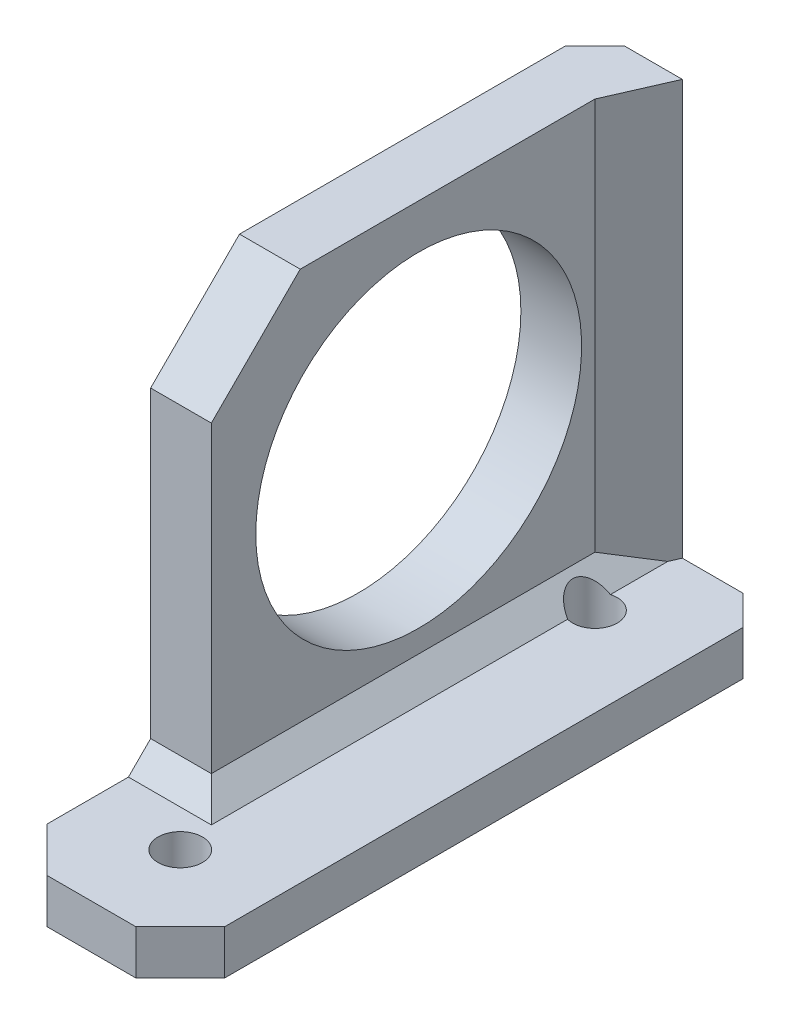
ISO-10303-21;
HEADER;
FILE_DESCRIPTION(('STEP AP214'),'2;1');
FILE_NAME('part.step','',(''),(''),'','','');
FILE_SCHEMA(('AUTOMOTIVE_DESIGN { 1 0 10303 214 1 1 1 1 }'));
ENDSEC;
DATA;
#1=APPLICATION_CONTEXT('core data for automotive mechanical design processes');
#2=APPLICATION_PROTOCOL_DEFINITION('international standard','automotive_design',2000,#1);
#3=PRODUCT_CONTEXT('',#1,'mechanical');
#4=PRODUCT('Part','Part','',(#3));
#5=PRODUCT_RELATED_PRODUCT_CATEGORY('part','',(#4));
#6=PRODUCT_DEFINITION_FORMATION('','',#4);
#7=PRODUCT_DEFINITION_CONTEXT('part definition',#1,'design');
#8=PRODUCT_DEFINITION('design','',#6,#7);
#9=PRODUCT_DEFINITION_SHAPE('','',#8);
#10=(LENGTH_UNIT() NAMED_UNIT(*) SI_UNIT(.MILLI.,.METRE.));
#11=(NAMED_UNIT(*) PLANE_ANGLE_UNIT() SI_UNIT($,.RADIAN.));
#12=(NAMED_UNIT(*) SI_UNIT($,.STERADIAN.) SOLID_ANGLE_UNIT());
#13=UNCERTAINTY_MEASURE_WITH_UNIT(LENGTH_MEASURE(1.E-05),#10,'distance_accuracy_value','');
#14=(GEOMETRIC_REPRESENTATION_CONTEXT(3) GLOBAL_UNCERTAINTY_ASSIGNED_CONTEXT((#13)) GLOBAL_UNIT_ASSIGNED_CONTEXT((#10,
#11,#12)) REPRESENTATION_CONTEXT('',''));
#15=CARTESIAN_POINT('',(0.,0.,0.));
#16=DIRECTION('',(0.,0.,1.));
#17=DIRECTION('',(1.,0.,0.));
#18=AXIS2_PLACEMENT_3D('',#15,#16,#17);
#19=CARTESIAN_POINT('',(6.,3.,-20.));
#20=DIRECTION('',(-1.,0.,0.));
#21=DIRECTION('',(0.,0.,1.));
#22=AXIS2_PLACEMENT_3D('',#19,#20,#21);
#23=PLANE('',#22);
#24=DIRECTION('',(0.,1.,0.));
#25=VECTOR('',#24,1.);
#26=CARTESIAN_POINT('',(6.,3.,-18.));
#27=LINE('',#26,#25);
#28=CARTESIAN_POINT('',(6.,0.,-18.));
#29=VERTEX_POINT('',#28);
#30=CARTESIAN_POINT('',(6.,3.,-18.));
#31=VERTEX_POINT('',#30);
#32=EDGE_CURVE('E197',#29,#31,#27,.T.);
#33=ORIENTED_EDGE('',*,*,#32,.T.);
#34=DIRECTION('',(0.,0.,-1.));
#35=VECTOR('',#34,1.);
#36=CARTESIAN_POINT('',(6.,3.,-20.));
#37=LINE('',#36,#35);
#38=CARTESIAN_POINT('',(6.,3.,17.));
#39=VERTEX_POINT('',#38);
#40=EDGE_CURVE('E178',#39,#31,#37,.T.);
#41=ORIENTED_EDGE('',*,*,#40,.F.);
#42=DIRECTION('',(0.,-1.,0.));
#43=VECTOR('',#42,1.);
#44=CARTESIAN_POINT('',(6.,3.,17.));
#45=LINE('',#44,#43);
#46=CARTESIAN_POINT('',(6.,0.,17.));
#47=VERTEX_POINT('',#46);
#48=EDGE_CURVE('E177',#39,#47,#45,.T.);
#49=ORIENTED_EDGE('',*,*,#48,.T.);
#50=DIRECTION('',(0.,0.,-1.));
#51=VECTOR('',#50,1.);
#52=CARTESIAN_POINT('',(6.,0.,-20.));
#53=LINE('',#52,#51);
#54=EDGE_CURVE('E340',#47,#29,#53,.T.);
#55=ORIENTED_EDGE('',*,*,#54,.T.);
#56=EDGE_LOOP('',(#33,#41,#49,#55));
#57=FACE_BOUND('',#56,.T.);
#58=ADVANCED_FACE('F51',(#57),#23,.F.);
#59=CARTESIAN_POINT('',(-6.,3.,-20.));
#60=DIRECTION('',(0.,0.,1.));
#61=DIRECTION('',(1.,0.,0.));
#62=AXIS2_PLACEMENT_3D('',#59,#60,#61);
#63=PLANE('',#62);
#64=DIRECTION('',(-1.,0.,0.));
#65=VECTOR('',#64,1.);
#66=CARTESIAN_POINT('',(-6.,3.,-20.));
#67=LINE('',#66,#65);
#68=CARTESIAN_POINT('',(4.,3.,-20.));
#69=VERTEX_POINT('',#68);
#70=CARTESIAN_POINT('',(-0.0999999999999959,3.,-20.));
#71=VERTEX_POINT('',#70);
#72=EDGE_CURVE('E165',#69,#71,#67,.T.);
#73=ORIENTED_EDGE('',*,*,#72,.F.);
#74=DIRECTION('',(0.,-1.,0.));
#75=VECTOR('',#74,1.);
#76=CARTESIAN_POINT('',(4.,3.,-20.));
#77=LINE('',#76,#75);
#78=CARTESIAN_POINT('',(4.,0.,-20.));
#79=VERTEX_POINT('',#78);
#80=EDGE_CURVE('E170',#69,#79,#77,.T.);
#81=ORIENTED_EDGE('',*,*,#80,.T.);
#82=DIRECTION('',(-1.,0.,0.));
#83=VECTOR('',#82,1.);
#84=CARTESIAN_POINT('',(-6.,0.,-20.));
#85=LINE('',#84,#83);
#86=CARTESIAN_POINT('',(-4.,0.,-20.));
#87=VERTEX_POINT('',#86);
#88=EDGE_CURVE('E319',#79,#87,#85,.T.);
#89=ORIENTED_EDGE('',*,*,#88,.T.);
#90=DIRECTION('',(0.,1.,0.));
#91=VECTOR('',#90,1.);
#92=CARTESIAN_POINT('',(-4.,3.,-20.));
#93=LINE('',#92,#91);
#94=CARTESIAN_POINT('',(-4.,31.,-20.));
#95=VERTEX_POINT('',#94);
#96=EDGE_CURVE('E232',#87,#95,#93,.T.);
#97=ORIENTED_EDGE('',*,*,#96,.T.);
#98=DIRECTION('',(1.,0.,0.));
#99=VECTOR('',#98,1.);
#100=CARTESIAN_POINT('',(-6.,31.,-20.));
#101=LINE('',#100,#99);
#102=CARTESIAN_POINT('',(-0.0999999999999959,31.,-20.));
#103=VERTEX_POINT('',#102);
#104=EDGE_CURVE('E295',#95,#103,#101,.T.);
#105=ORIENTED_EDGE('',*,*,#104,.T.);
#106=DIRECTION('',(0.,-1.,0.));
#107=VECTOR('',#106,1.);
#108=CARTESIAN_POINT('',(-0.0999999999999959,31.,-20.));
#109=LINE('',#108,#107);
#110=EDGE_CURVE('E173',#103,#71,#109,.T.);
#111=ORIENTED_EDGE('',*,*,#110,.T.);
#112=EDGE_LOOP('',(#73,#81,#89,#97,#105,#111));
#113=FACE_BOUND('',#112,.T.);
#114=ADVANCED_FACE('F167',(#113),#63,.F.);
#115=CARTESIAN_POINT('',(4.,3.,-20.));
#116=DIRECTION('',(-0.707106781186547,0.,0.707106781186547));
#117=DIRECTION('',(0.,-1.,0.));
#118=AXIS2_PLACEMENT_3D('',#115,#116,#117);
#119=PLANE('',#118);
#120=ORIENTED_EDGE('',*,*,#80,.F.);
#121=DIRECTION('',(-0.707106781186548,0.,-0.707106781186548));
#122=VECTOR('',#121,1.);
#123=CARTESIAN_POINT('',(4.,3.,-20.));
#124=LINE('',#123,#122);
#125=EDGE_CURVE('E181',#69,#31,#124,.F.);
#126=ORIENTED_EDGE('',*,*,#125,.T.);
#127=ORIENTED_EDGE('',*,*,#32,.F.);
#128=DIRECTION('',(-0.707106781186548,0.,-0.707106781186548));
#129=VECTOR('',#128,1.);
#130=CARTESIAN_POINT('',(4.,0.,-20.));
#131=LINE('',#130,#129);
#132=EDGE_CURVE('E193',#79,#29,#131,.F.);
#133=ORIENTED_EDGE('',*,*,#132,.F.);
#134=EDGE_LOOP('',(#120,#126,#127,#133));
#135=FACE_BOUND('',#134,.T.);
#136=ADVANCED_FACE('F192',(#135),#119,.F.);
#137=CARTESIAN_POINT('',(0.,3.,0.));
#138=DIRECTION('',(0.,1.,0.));
#139=DIRECTION('',(0.,0.,1.));
#140=AXIS2_PLACEMENT_3D('',#137,#138,#139);
#141=PLANE('',#140);
#142=DIRECTION('',(-0.401990062035199,0.,0.915644030191284));
#143=VECTOR('',#142,1.);
#144=CARTESIAN_POINT('',(-0.0999999999999959,3.,-20.));
#145=LINE('',#144,#143);
#146=CARTESIAN_POINT('',(-0.400000000000014,3.,-19.3166666666666));
#147=VERTEX_POINT('',#146);
#148=EDGE_CURVE('E211',#71,#147,#145,.T.);
#149=ORIENTED_EDGE('',*,*,#148,.T.);
#150=DIRECTION('',(0.,0.,1.));
#151=VECTOR('',#150,1.);
#152=CARTESIAN_POINT('',(-0.400000000000015,3.,0.));
#153=LINE('',#152,#151);
#154=CARTESIAN_POINT('',(-0.400000000000015,3.,-15.4456832294801));
#155=VERTEX_POINT('',#154);
#156=EDGE_CURVE('E245',#147,#155,#153,.T.);
#157=ORIENTED_EDGE('',*,*,#156,.T.);
#158=CARTESIAN_POINT('',(0.,3.,-14.));
#159=DIRECTION('',(0.,1.,0.));
#160=DIRECTION('',(0.,0.,1.));
#161=AXIS2_PLACEMENT_3D('',#158,#159,#160);
#162=CIRCLE('',#161,1.5);
#163=CARTESIAN_POINT('',(-0.400000000000015,3.,-12.5543167705199));
#164=VERTEX_POINT('',#163);
#165=EDGE_CURVE('E309',#164,#155,#162,.T.);
#166=ORIENTED_EDGE('',*,*,#165,.F.);
#167=DIRECTION('',(0.,0.,1.));
#168=VECTOR('',#167,1.);
#169=CARTESIAN_POINT('',(-0.400000000000015,3.,0.));
#170=LINE('',#169,#168);
#171=CARTESIAN_POINT('',(-0.400000000000015,3.,11.5));
#172=VERTEX_POINT('',#171);
#173=EDGE_CURVE('E77',#164,#172,#170,.T.);
#174=ORIENTED_EDGE('',*,*,#173,.T.);
#175=DIRECTION('',(-1.,0.,0.));
#176=VECTOR('',#175,1.);
#177=CARTESIAN_POINT('',(0.,3.,11.5));
#178=LINE('',#177,#176);
#179=CARTESIAN_POINT('',(-6.,3.,11.5));
#180=VERTEX_POINT('',#179);
#181=EDGE_CURVE('E242',#172,#180,#178,.T.);
#182=ORIENTED_EDGE('',*,*,#181,.T.);
#183=DIRECTION('',(0.,0.,1.));
#184=VECTOR('',#183,1.);
#185=CARTESIAN_POINT('',(-6.,3.,-20.));
#186=LINE('',#185,#184);
#187=CARTESIAN_POINT('',(-6.,3.,17.));
#188=VERTEX_POINT('',#187);
#189=EDGE_CURVE('E264',#180,#188,#186,.T.);
#190=ORIENTED_EDGE('',*,*,#189,.T.);
#191=DIRECTION('',(0.707106781186548,0.,0.707106781186548));
#192=VECTOR('',#191,1.);
#193=CARTESIAN_POINT('',(-6.,3.,17.));
#194=LINE('',#193,#192);
#195=CARTESIAN_POINT('',(-3.,3.,20.));
#196=VERTEX_POINT('',#195);
#197=EDGE_CURVE('E318',#188,#196,#194,.T.);
#198=ORIENTED_EDGE('',*,*,#197,.T.);
#199=DIRECTION('',(1.,0.,0.));
#200=VECTOR('',#199,1.);
#201=CARTESIAN_POINT('',(-3.,3.,20.));
#202=LINE('',#201,#200);
#203=CARTESIAN_POINT('',(3.,3.,20.));
#204=VERTEX_POINT('',#203);
#205=EDGE_CURVE('E322',#196,#204,#202,.T.);
#206=ORIENTED_EDGE('',*,*,#205,.T.);
#207=DIRECTION('',(0.707106781186548,0.,-0.707106781186547));
#208=VECTOR('',#207,1.);
#209=CARTESIAN_POINT('',(3.,3.,20.));
#210=LINE('',#209,#208);
#211=EDGE_CURVE('E325',#204,#39,#210,.T.);
#212=ORIENTED_EDGE('',*,*,#211,.T.);
#213=ORIENTED_EDGE('',*,*,#40,.T.);
#214=ORIENTED_EDGE('',*,*,#125,.F.);
#215=ORIENTED_EDGE('',*,*,#72,.T.);
#216=EDGE_LOOP('',(#149,#157,#166,#174,#182,#190,#198,#206,#212,#213,#214,#215));
#217=FACE_BOUND('',#216,.T.);
#218=CARTESIAN_POINT('',(0.,3.,14.));
#219=DIRECTION('',(0.,1.,0.));
#220=DIRECTION('',(0.,0.,1.));
#221=AXIS2_PLACEMENT_3D('',#218,#219,#220);
#222=CIRCLE('',#221,1.5);
#223=CARTESIAN_POINT('',(0.,3.,15.5));
#224=VERTEX_POINT('',#223);
#225=EDGE_CURVE('E301',#224,#224,#222,.T.);
#226=ORIENTED_EDGE('',*,*,#225,.F.);
#227=EDGE_LOOP('',(#226));
#228=FACE_BOUND('',#227,.T.);
#229=ADVANCED_FACE('F182',(#217,#228),#141,.T.);
#230=CARTESIAN_POINT('',(0.,0.,0.));
#231=DIRECTION('',(0.,1.,0.));
#232=DIRECTION('',(0.,0.,1.));
#233=AXIS2_PLACEMENT_3D('',#230,#231,#232);
#234=PLANE('',#233);
#235=DIRECTION('',(0.,0.,1.));
#236=VECTOR('',#235,1.);
#237=CARTESIAN_POINT('',(-6.,0.,-20.));
#238=LINE('',#237,#236);
#239=CARTESIAN_POINT('',(-6.,0.,-18.));
#240=VERTEX_POINT('',#239);
#241=CARTESIAN_POINT('',(-6.,0.,17.));
#242=VERTEX_POINT('',#241);
#243=EDGE_CURVE('E312',#240,#242,#238,.T.);
#244=ORIENTED_EDGE('',*,*,#243,.F.);
#245=DIRECTION('',(-0.707106781186548,0.,0.707106781186548));
#246=VECTOR('',#245,1.);
#247=CARTESIAN_POINT('',(-6.,0.,-18.));
#248=LINE('',#247,#246);
#249=EDGE_CURVE('E229',#240,#87,#248,.F.);
#250=ORIENTED_EDGE('',*,*,#249,.T.);
#251=ORIENTED_EDGE('',*,*,#88,.F.);
#252=ORIENTED_EDGE('',*,*,#132,.T.);
#253=ORIENTED_EDGE('',*,*,#54,.F.);
#254=DIRECTION('',(0.707106781186548,0.,-0.707106781186547));
#255=VECTOR('',#254,1.);
#256=CARTESIAN_POINT('',(3.,0.,20.));
#257=LINE('',#256,#255);
#258=CARTESIAN_POINT('',(3.,0.,20.));
#259=VERTEX_POINT('',#258);
#260=EDGE_CURVE('E338',#259,#47,#257,.T.);
#261=ORIENTED_EDGE('',*,*,#260,.F.);
#262=DIRECTION('',(1.,0.,0.));
#263=VECTOR('',#262,1.);
#264=CARTESIAN_POINT('',(-3.,0.,20.));
#265=LINE('',#264,#263);
#266=CARTESIAN_POINT('',(-3.,0.,20.));
#267=VERTEX_POINT('',#266);
#268=EDGE_CURVE('E335',#267,#259,#265,.T.);
#269=ORIENTED_EDGE('',*,*,#268,.F.);
#270=DIRECTION('',(0.707106781186548,0.,0.707106781186548));
#271=VECTOR('',#270,1.);
#272=CARTESIAN_POINT('',(-6.,0.,17.));
#273=LINE('',#272,#271);
#274=EDGE_CURVE('E332',#242,#267,#273,.T.);
#275=ORIENTED_EDGE('',*,*,#274,.F.);
#276=EDGE_LOOP('',(#244,#250,#251,#252,#253,#261,#269,#275));
#277=FACE_BOUND('',#276,.T.);
#278=CARTESIAN_POINT('',(0.,0.,-14.));
#279=DIRECTION('',(0.,1.,0.));
#280=DIRECTION('',(0.,0.,1.));
#281=AXIS2_PLACEMENT_3D('',#278,#279,#280);
#282=CIRCLE('',#281,1.5);
#283=CARTESIAN_POINT('',(0.,0.,-12.5));
#284=VERTEX_POINT('',#283);
#285=EDGE_CURVE('E305',#284,#284,#282,.T.);
#286=ORIENTED_EDGE('',*,*,#285,.T.);
#287=EDGE_LOOP('',(#286));
#288=FACE_BOUND('',#287,.T.);
#289=CARTESIAN_POINT('',(0.,0.,14.));
#290=DIRECTION('',(0.,1.,0.));
#291=DIRECTION('',(0.,0.,1.));
#292=AXIS2_PLACEMENT_3D('',#289,#290,#291);
#293=CIRCLE('',#292,1.5);
#294=CARTESIAN_POINT('',(0.,0.,15.5));
#295=VERTEX_POINT('',#294);
#296=EDGE_CURVE('E272',#295,#295,#293,.T.);
#297=ORIENTED_EDGE('',*,*,#296,.T.);
#298=EDGE_LOOP('',(#297));
#299=FACE_BOUND('',#298,.T.);
#300=ADVANCED_FACE('F363',(#277,#288,#299),#234,.F.);
#301=CARTESIAN_POINT('',(-6.,3.,-20.));
#302=DIRECTION('',(1.,0.,0.));
#303=DIRECTION('',(0.,0.,-1.));
#304=AXIS2_PLACEMENT_3D('',#301,#302,#303);
#305=PLANE('',#304);
#306=CARTESIAN_POINT('',(-6.,17.,-4.));
#307=DIRECTION('',(1.,0.,0.));
#308=DIRECTION('',(0.,0.,-1.));
#309=AXIS2_PLACEMENT_3D('',#306,#307,#308);
#310=CIRCLE('',#309,11.);
#311=CARTESIAN_POINT('',(-6.,17.,-15.));
#312=VERTEX_POINT('',#311);
#313=EDGE_CURVE('E212',#312,#312,#310,.T.);
#314=ORIENTED_EDGE('',*,*,#313,.T.);
#315=EDGE_LOOP('',(#314));
#316=FACE_BOUND('',#315,.T.);
#317=DIRECTION('',(0.,0.,-1.));
#318=VECTOR('',#317,1.);
#319=CARTESIAN_POINT('',(-6.,31.,10.));
#320=LINE('',#319,#318);
#321=CARTESIAN_POINT('',(-6.,31.,3.99999999999998));
#322=VERTEX_POINT('',#321);
#323=CARTESIAN_POINT('',(-6.,31.,-18.));
#324=VERTEX_POINT('',#323);
#325=EDGE_CURVE('E288',#322,#324,#320,.T.);
#326=ORIENTED_EDGE('',*,*,#325,.T.);
#327=DIRECTION('',(0.,-1.,0.));
#328=VECTOR('',#327,1.);
#329=CARTESIAN_POINT('',(-6.,3.,-18.));
#330=LINE('',#329,#328);
#331=EDGE_CURVE('E225',#324,#240,#330,.T.);
#332=ORIENTED_EDGE('',*,*,#331,.T.);
#333=ORIENTED_EDGE('',*,*,#243,.T.);
#334=DIRECTION('',(0.,-1.,0.));
#335=VECTOR('',#334,1.);
#336=CARTESIAN_POINT('',(-6.,3.,17.));
#337=LINE('',#336,#335);
#338=EDGE_CURVE('E195',#188,#242,#337,.T.);
#339=ORIENTED_EDGE('',*,*,#338,.F.);
#340=ORIENTED_EDGE('',*,*,#189,.F.);
#341=DIRECTION('',(0.,0.707106781186547,-0.707106781186548));
#342=VECTOR('',#341,1.);
#343=CARTESIAN_POINT('',(-6.,18.75,-4.25000000000002));
#344=LINE('',#343,#342);
#345=CARTESIAN_POINT('',(-6.,4.49999999999999,10.));
#346=VERTEX_POINT('',#345);
#347=EDGE_CURVE('E62',#180,#346,#344,.T.);
#348=ORIENTED_EDGE('',*,*,#347,.T.);
#349=DIRECTION('',(0.,-1.,0.));
#350=VECTOR('',#349,1.);
#351=CARTESIAN_POINT('',(-6.,31.,10.));
#352=LINE('',#351,#350);
#353=CARTESIAN_POINT('',(-6.,25.,10.));
#354=VERTEX_POINT('',#353);
#355=EDGE_CURVE('E261',#354,#346,#352,.T.);
#356=ORIENTED_EDGE('',*,*,#355,.F.);
#357=DIRECTION('',(0.,0.707106781186547,-0.707106781186548));
#358=VECTOR('',#357,1.);
#359=CARTESIAN_POINT('',(-6.,31.,3.99999999999998));
#360=LINE('',#359,#358);
#361=EDGE_CURVE('E222',#354,#322,#360,.T.);
#362=ORIENTED_EDGE('',*,*,#361,.T.);
#363=EDGE_LOOP('',(#326,#332,#333,#339,#340,#348,#356,#362));
#364=FACE_BOUND('',#363,.T.);
#365=ADVANCED_FACE('F260',(#316,#364),#305,.F.);
#366=CARTESIAN_POINT('',(-6.,3.,17.));
#367=DIRECTION('',(0.707106781186547,0.,-0.707106781186547));
#368=DIRECTION('',(-0.707106781186548,0.,-0.707106781186548));
#369=AXIS2_PLACEMENT_3D('',#366,#367,#368);
#370=PLANE('',#369);
#371=ORIENTED_EDGE('',*,*,#274,.T.);
#372=DIRECTION('',(0.,-1.,0.));
#373=VECTOR('',#372,1.);
#374=CARTESIAN_POINT('',(-3.,3.,20.));
#375=LINE('',#374,#373);
#376=EDGE_CURVE('E201',#196,#267,#375,.T.);
#377=ORIENTED_EDGE('',*,*,#376,.F.);
#378=ORIENTED_EDGE('',*,*,#197,.F.);
#379=ORIENTED_EDGE('',*,*,#338,.T.);
#380=EDGE_LOOP('',(#371,#377,#378,#379));
#381=FACE_BOUND('',#380,.T.);
#382=ADVANCED_FACE('F385',(#381),#370,.F.);
#383=CARTESIAN_POINT('',(-3.,3.,20.));
#384=DIRECTION('',(0.,0.,-1.));
#385=DIRECTION('',(-1.,0.,0.));
#386=AXIS2_PLACEMENT_3D('',#383,#384,#385);
#387=PLANE('',#386);
#388=ORIENTED_EDGE('',*,*,#268,.T.);
#389=DIRECTION('',(0.,-1.,0.));
#390=VECTOR('',#389,1.);
#391=CARTESIAN_POINT('',(3.,3.,20.));
#392=LINE('',#391,#390);
#393=EDGE_CURVE('E346',#204,#259,#392,.T.);
#394=ORIENTED_EDGE('',*,*,#393,.F.);
#395=ORIENTED_EDGE('',*,*,#205,.F.);
#396=ORIENTED_EDGE('',*,*,#376,.T.);
#397=EDGE_LOOP('',(#388,#394,#395,#396));
#398=FACE_BOUND('',#397,.T.);
#399=ADVANCED_FACE('F355',(#398),#387,.F.);
#400=CARTESIAN_POINT('',(3.,3.,20.));
#401=DIRECTION('',(-0.707106781186547,0.,-0.707106781186548));
#402=DIRECTION('',(-0.707106781186548,0.,0.707106781186547));
#403=AXIS2_PLACEMENT_3D('',#400,#401,#402);
#404=PLANE('',#403);
#405=ORIENTED_EDGE('',*,*,#260,.T.);
#406=ORIENTED_EDGE('',*,*,#48,.F.);
#407=ORIENTED_EDGE('',*,*,#211,.F.);
#408=ORIENTED_EDGE('',*,*,#393,.T.);
#409=EDGE_LOOP('',(#405,#406,#407,#408));
#410=FACE_BOUND('',#409,.T.);
#411=ADVANCED_FACE('F368',(#410),#404,.F.);
#412=CARTESIAN_POINT('',(0.,3.,-14.));
#413=DIRECTION('',(0.,-1.,0.));
#414=DIRECTION('',(0.,0.,-1.));
#415=AXIS2_PLACEMENT_3D('',#412,#413,#414);
#416=CYLINDRICAL_SURFACE('',#415,1.5);
#417=ORIENTED_EDGE('',*,*,#165,.T.);
#418=CARTESIAN_POINT('',(0.,2.59999999999999,-14.));
#419=DIRECTION('',(-0.707106781186547,-0.707106781186548,0.));
#420=DIRECTION('',(0.707106781186548,-0.707106781186547,0.));
#421=AXIS2_PLACEMENT_3D('',#418,#419,#420);
#422=ELLIPSE('',#421,2.12132034355964,1.5);
#423=EDGE_CURVE('E11',#155,#164,#422,.F.);
#424=ORIENTED_EDGE('',*,*,#423,.T.);
#425=EDGE_LOOP('',(#417,#424));
#426=FACE_BOUND('',#425,.T.);
#427=ORIENTED_EDGE('',*,*,#285,.F.);
#428=EDGE_LOOP('',(#427));
#429=FACE_BOUND('',#428,.T.);
#430=ADVANCED_FACE('F382',(#426,#429),#416,.F.);
#431=CARTESIAN_POINT('',(0.,3.,14.));
#432=DIRECTION('',(0.,-1.,0.));
#433=DIRECTION('',(0.,0.,-1.));
#434=AXIS2_PLACEMENT_3D('',#431,#432,#433);
#435=CYLINDRICAL_SURFACE('',#434,1.5);
#436=ORIENTED_EDGE('',*,*,#225,.T.);
#437=EDGE_LOOP('',(#436));
#438=FACE_BOUND('',#437,.T.);
#439=ORIENTED_EDGE('',*,*,#296,.F.);
#440=EDGE_LOOP('',(#439));
#441=FACE_BOUND('',#440,.T.);
#442=ADVANCED_FACE('F444',(#438,#441),#435,.F.);
#443=CARTESIAN_POINT('',(-6.,31.,10.));
#444=DIRECTION('',(0.,0.,-1.));
#445=DIRECTION('',(-1.,0.,0.));
#446=AXIS2_PLACEMENT_3D('',#443,#444,#445);
#447=PLANE('',#446);
#448=ORIENTED_EDGE('',*,*,#355,.T.);
#449=DIRECTION('',(1.,0.,0.));
#450=VECTOR('',#449,1.);
#451=CARTESIAN_POINT('',(-6.,4.49999999999999,10.));
#452=LINE('',#451,#450);
#453=CARTESIAN_POINT('',(-1.9,4.49999999999999,10.));
#454=VERTEX_POINT('',#453);
#455=EDGE_CURVE('E189',#346,#454,#452,.T.);
#456=ORIENTED_EDGE('',*,*,#455,.T.);
#457=DIRECTION('',(0.,-1.,0.));
#458=VECTOR('',#457,1.);
#459=CARTESIAN_POINT('',(-1.9,31.,10.));
#460=LINE('',#459,#458);
#461=CARTESIAN_POINT('',(-1.9,25.,10.));
#462=VERTEX_POINT('',#461);
#463=EDGE_CURVE('E273',#462,#454,#460,.T.);
#464=ORIENTED_EDGE('',*,*,#463,.F.);
#465=DIRECTION('',(-1.,0.,0.));
#466=VECTOR('',#465,1.);
#467=CARTESIAN_POINT('',(-6.,25.,10.));
#468=LINE('',#467,#466);
#469=EDGE_CURVE('E219',#462,#354,#468,.T.);
#470=ORIENTED_EDGE('',*,*,#469,.T.);
#471=EDGE_LOOP('',(#448,#456,#464,#470));
#472=FACE_BOUND('',#471,.T.);
#473=ADVANCED_FACE('F268',(#472),#447,.F.);
#474=CARTESIAN_POINT('',(-1.9,31.,10.));
#475=DIRECTION('',(-1.,0.,0.));
#476=DIRECTION('',(0.,0.,1.));
#477=AXIS2_PLACEMENT_3D('',#474,#475,#476);
#478=PLANE('',#477);
#479=CARTESIAN_POINT('',(-1.9,17.,-4.));
#480=DIRECTION('',(-1.,0.,0.));
#481=DIRECTION('',(0.,0.,1.));
#482=AXIS2_PLACEMENT_3D('',#479,#480,#481);
#483=CIRCLE('',#482,11.);
#484=CARTESIAN_POINT('',(-1.9,17.,7.));
#485=VERTEX_POINT('',#484);
#486=EDGE_CURVE('E207',#485,#485,#483,.F.);
#487=ORIENTED_EDGE('',*,*,#486,.F.);
#488=EDGE_LOOP('',(#487));
#489=FACE_BOUND('',#488,.T.);
#490=ORIENTED_EDGE('',*,*,#463,.T.);
#491=DIRECTION('',(0.,0.,-1.));
#492=VECTOR('',#491,1.);
#493=CARTESIAN_POINT('',(-1.9,4.49999999999999,10.));
#494=LINE('',#493,#492);
#495=CARTESIAN_POINT('',(-1.9,4.49999999999999,-15.9));
#496=VERTEX_POINT('',#495);
#497=EDGE_CURVE('E69',#454,#496,#494,.T.);
#498=ORIENTED_EDGE('',*,*,#497,.T.);
#499=DIRECTION('',(0.,-1.,0.));
#500=VECTOR('',#499,1.);
#501=CARTESIAN_POINT('',(-1.9,31.,-15.9));
#502=LINE('',#501,#500);
#503=CARTESIAN_POINT('',(-1.9,31.,-15.9));
#504=VERTEX_POINT('',#503);
#505=EDGE_CURVE('E285',#504,#496,#502,.T.);
#506=ORIENTED_EDGE('',*,*,#505,.F.);
#507=DIRECTION('',(0.,0.,-1.));
#508=VECTOR('',#507,1.);
#509=CARTESIAN_POINT('',(-1.9,31.,10.));
#510=LINE('',#509,#508);
#511=CARTESIAN_POINT('',(-1.9,31.,3.99999999999998));
#512=VERTEX_POINT('',#511);
#513=EDGE_CURVE('E291',#512,#504,#510,.T.);
#514=ORIENTED_EDGE('',*,*,#513,.F.);
#515=DIRECTION('',(0.,-0.707106781186547,0.707106781186548));
#516=VECTOR('',#515,1.);
#517=CARTESIAN_POINT('',(-1.9,31.,3.99999999999998));
#518=LINE('',#517,#516);
#519=EDGE_CURVE('E216',#512,#462,#518,.T.);
#520=ORIENTED_EDGE('',*,*,#519,.T.);
#521=EDGE_LOOP('',(#490,#498,#506,#514,#520));
#522=FACE_BOUND('',#521,.T.);
#523=ADVANCED_FACE('F427',(#489,#522),#478,.F.);
#524=CARTESIAN_POINT('',(-0.0999999999999959,31.,-20.));
#525=DIRECTION('',(0.915644030191284,0.,0.401990062035199));
#526=DIRECTION('',(0.401990062035199,0.,-0.915644030191284));
#527=AXIS2_PLACEMENT_3D('',#524,#525,#526);
#528=PLANE('',#527);
#529=ORIENTED_EDGE('',*,*,#505,.T.);
#530=DIRECTION('',(0.372981903334043,-0.372981903334043,-0.849569890927539));
#531=VECTOR('',#530,1.);
#532=CARTESIAN_POINT('',(-4.03696865607559,6.63696865607557,-11.0324602833834));
#533=LINE('',#532,#531);
#534=EDGE_CURVE('E250',#496,#147,#533,.T.);
#535=ORIENTED_EDGE('',*,*,#534,.T.);
#536=ORIENTED_EDGE('',*,*,#148,.F.);
#537=ORIENTED_EDGE('',*,*,#110,.F.);
#538=DIRECTION('',(-0.401990062035199,0.,0.915644030191284));
#539=VECTOR('',#538,1.);
#540=CARTESIAN_POINT('',(-0.0999999999999959,31.,-20.));
#541=LINE('',#540,#539);
#542=EDGE_CURVE('E583',#103,#504,#541,.T.);
#543=ORIENTED_EDGE('',*,*,#542,.T.);
#544=EDGE_LOOP('',(#529,#535,#536,#537,#543));
#545=FACE_BOUND('',#544,.T.);
#546=ADVANCED_FACE('F283',(#545),#528,.T.);
#547=CARTESIAN_POINT('',(0.,31.,0.));
#548=DIRECTION('',(0.,1.,0.));
#549=DIRECTION('',(0.,0.,1.));
#550=AXIS2_PLACEMENT_3D('',#547,#548,#549);
#551=PLANE('',#550);
#552=ORIENTED_EDGE('',*,*,#104,.F.);
#553=DIRECTION('',(0.707106781186548,0.,-0.707106781186548));
#554=VECTOR('',#553,1.);
#555=CARTESIAN_POINT('',(-12.,31.,-12.));
#556=LINE('',#555,#554);
#557=EDGE_CURVE('E190',#95,#324,#556,.F.);
#558=ORIENTED_EDGE('',*,*,#557,.T.);
#559=ORIENTED_EDGE('',*,*,#325,.F.);
#560=DIRECTION('',(1.,0.,0.));
#561=VECTOR('',#560,1.);
#562=CARTESIAN_POINT('',(-1.9,31.,3.99999999999998));
#563=LINE('',#562,#561);
#564=EDGE_CURVE('E206',#322,#512,#563,.T.);
#565=ORIENTED_EDGE('',*,*,#564,.T.);
#566=ORIENTED_EDGE('',*,*,#513,.T.);
#567=ORIENTED_EDGE('',*,*,#542,.F.);
#568=EDGE_LOOP('',(#552,#558,#559,#565,#566,#567));
#569=FACE_BOUND('',#568,.T.);
#570=ADVANCED_FACE('F426',(#569),#551,.T.);
#571=CARTESIAN_POINT('',(5.,17.,-4.));
#572=DIRECTION('',(-1.,0.,0.));
#573=DIRECTION('',(0.,0.,1.));
#574=AXIS2_PLACEMENT_3D('',#571,#572,#573);
#575=CYLINDRICAL_SURFACE('',#574,11.);
#576=ORIENTED_EDGE('',*,*,#313,.F.);
#577=EDGE_LOOP('',(#576));
#578=FACE_BOUND('',#577,.T.);
#579=ORIENTED_EDGE('',*,*,#486,.T.);
#580=EDGE_LOOP('',(#579));
#581=FACE_BOUND('',#580,.T.);
#582=ADVANCED_FACE('F404',(#578,#581),#575,.F.);
#583=CARTESIAN_POINT('',(0.,31.,3.99999999999998));
#584=DIRECTION('',(0.,0.707106781186548,0.707106781186547));
#585=DIRECTION('',(-1.,0.,0.));
#586=AXIS2_PLACEMENT_3D('',#583,#584,#585);
#587=PLANE('',#586);
#588=ORIENTED_EDGE('',*,*,#361,.F.);
#589=ORIENTED_EDGE('',*,*,#469,.F.);
#590=ORIENTED_EDGE('',*,*,#519,.F.);
#591=ORIENTED_EDGE('',*,*,#564,.F.);
#592=EDGE_LOOP('',(#588,#589,#590,#591));
#593=FACE_BOUND('',#592,.T.);
#594=ADVANCED_FACE('F397',(#593),#587,.T.);
#595=CARTESIAN_POINT('',(-6.,3.,-18.));
#596=DIRECTION('',(0.707106781186547,0.,0.707106781186547));
#597=DIRECTION('',(0.,-1.,0.));
#598=AXIS2_PLACEMENT_3D('',#595,#596,#597);
#599=PLANE('',#598);
#600=ORIENTED_EDGE('',*,*,#557,.F.);
#601=ORIENTED_EDGE('',*,*,#96,.F.);
#602=ORIENTED_EDGE('',*,*,#249,.F.);
#603=ORIENTED_EDGE('',*,*,#331,.F.);
#604=EDGE_LOOP('',(#600,#601,#602,#603));
#605=FACE_BOUND('',#604,.T.);
#606=ADVANCED_FACE('F403',(#605),#599,.F.);
#607=CARTESIAN_POINT('',(-1.9,4.49999999999999,10.));
#608=DIRECTION('',(-0.707106781186547,-0.707106781186548,0.));
#609=DIRECTION('',(0.,0.,-1.));
#610=AXIS2_PLACEMENT_3D('',#607,#608,#609);
#611=PLANE('',#610);
#612=ORIENTED_EDGE('',*,*,#534,.F.);
#613=ORIENTED_EDGE('',*,*,#497,.F.);
#614=DIRECTION('',(0.577350269189626,-0.577350269189626,0.577350269189626));
#615=VECTOR('',#614,1.);
#616=CARTESIAN_POINT('',(-1.9,4.49999999999999,10.));
#617=LINE('',#616,#615);
#618=EDGE_CURVE('E56',#172,#454,#617,.F.);
#619=ORIENTED_EDGE('',*,*,#618,.F.);
#620=ORIENTED_EDGE('',*,*,#173,.F.);
#621=ORIENTED_EDGE('',*,*,#423,.F.);
#622=ORIENTED_EDGE('',*,*,#156,.F.);
#623=EDGE_LOOP('',(#612,#613,#619,#620,#621,#622));
#624=FACE_BOUND('',#623,.T.);
#625=ADVANCED_FACE('F54',(#624),#611,.F.);
#626=CARTESIAN_POINT('',(-6.,4.49999999999999,10.));
#627=DIRECTION('',(0.,-0.707106781186548,-0.707106781186547));
#628=DIRECTION('',(1.,0.,0.));
#629=AXIS2_PLACEMENT_3D('',#626,#627,#628);
#630=PLANE('',#629);
#631=ORIENTED_EDGE('',*,*,#347,.F.);
#632=ORIENTED_EDGE('',*,*,#181,.F.);
#633=ORIENTED_EDGE('',*,*,#618,.T.);
#634=ORIENTED_EDGE('',*,*,#455,.F.);
#635=EDGE_LOOP('',(#631,#632,#633,#634));
#636=FACE_BOUND('',#635,.T.);
#637=ADVANCED_FACE('F275',(#636),#630,.F.);
#638=CLOSED_SHELL('',(#58,#114,#136,#229,#300,#365,#382,#399,#411,#430,#442,#473,#523,#546,#570,
#582,#594,#606,#625,#637));
#639=MANIFOLD_SOLID_BREP('B2',#638);
#640=ADVANCED_BREP_SHAPE_REPRESENTATION('',(#18,#639),#14);
#641=SHAPE_DEFINITION_REPRESENTATION(#9,#640);
ENDSEC;
END-ISO-10303-21;
